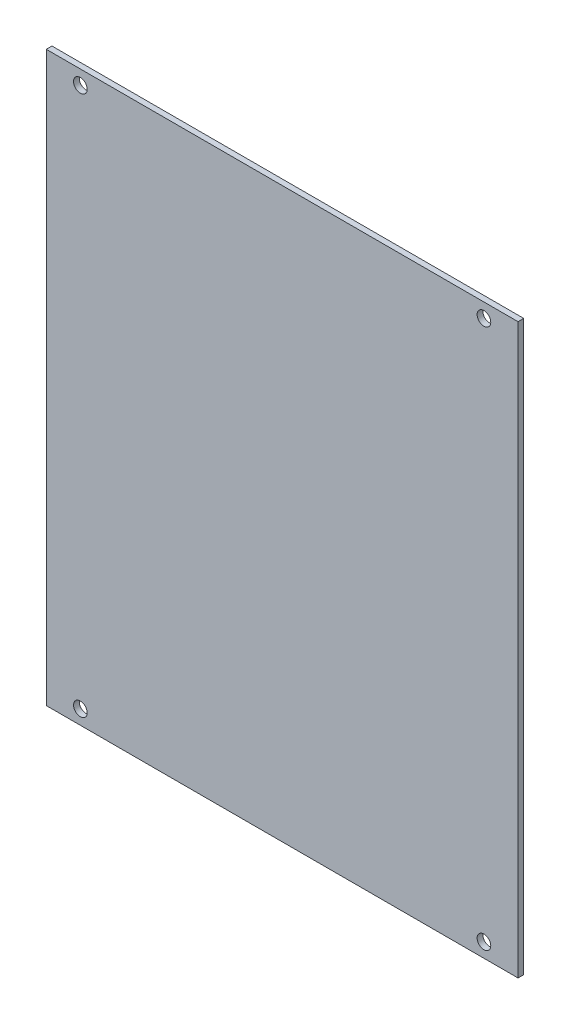
ISO-10303-21;
HEADER;
FILE_DESCRIPTION(('STEP AP214'),'2;1');
FILE_NAME('part.step','',(''),(''),'','','');
FILE_SCHEMA(('AUTOMOTIVE_DESIGN { 1 0 10303 214 1 1 1 1 }'));
ENDSEC;
DATA;
#1=APPLICATION_CONTEXT('core data for automotive mechanical design processes');
#2=APPLICATION_PROTOCOL_DEFINITION('international standard','automotive_design',2000,#1);
#3=PRODUCT_CONTEXT('',#1,'mechanical');
#4=PRODUCT('Part','Part','',(#3));
#5=PRODUCT_RELATED_PRODUCT_CATEGORY('part','',(#4));
#6=PRODUCT_DEFINITION_FORMATION('','',#4);
#7=PRODUCT_DEFINITION_CONTEXT('part definition',#1,'design');
#8=PRODUCT_DEFINITION('design','',#6,#7);
#9=PRODUCT_DEFINITION_SHAPE('','',#8);
#10=(LENGTH_UNIT() NAMED_UNIT(*) SI_UNIT(.MILLI.,.METRE.));
#11=(NAMED_UNIT(*) PLANE_ANGLE_UNIT() SI_UNIT($,.RADIAN.));
#12=(NAMED_UNIT(*) SI_UNIT($,.STERADIAN.) SOLID_ANGLE_UNIT());
#13=UNCERTAINTY_MEASURE_WITH_UNIT(LENGTH_MEASURE(1.E-05),#10,'distance_accuracy_value','');
#14=(GEOMETRIC_REPRESENTATION_CONTEXT(3) GLOBAL_UNCERTAINTY_ASSIGNED_CONTEXT((#13)) GLOBAL_UNIT_ASSIGNED_CONTEXT((#10,
#11,#12)) REPRESENTATION_CONTEXT('',''));
#15=CARTESIAN_POINT('',(0.,0.,0.));
#16=DIRECTION('',(0.,0.,1.));
#17=DIRECTION('',(1.,0.,0.));
#18=AXIS2_PLACEMENT_3D('',#15,#16,#17);
#19=CARTESIAN_POINT('',(41.5,-50.,0.5));
#20=DIRECTION('',(-1.,0.,0.));
#21=DIRECTION('',(0.,0.,1.));
#22=AXIS2_PLACEMENT_3D('',#19,#20,#21);
#23=PLANE('',#22);
#24=DIRECTION('',(0.,1.,0.));
#25=VECTOR('',#24,1.);
#26=CARTESIAN_POINT('',(41.5,-50.,-0.5));
#27=LINE('',#26,#25);
#28=CARTESIAN_POINT('',(41.5,-50.,-0.5));
#29=VERTEX_POINT('',#28);
#30=CARTESIAN_POINT('',(41.5,50.,-0.5));
#31=VERTEX_POINT('',#30);
#32=EDGE_CURVE('E97',#29,#31,#27,.T.);
#33=ORIENTED_EDGE('',*,*,#32,.T.);
#34=DIRECTION('',(0.,0.,-1.));
#35=VECTOR('',#34,1.);
#36=CARTESIAN_POINT('',(41.5,50.,0.5));
#37=LINE('',#36,#35);
#38=CARTESIAN_POINT('',(41.5,50.,0.5));
#39=VERTEX_POINT('',#38);
#40=EDGE_CURVE('E11',#39,#31,#37,.T.);
#41=ORIENTED_EDGE('',*,*,#40,.F.);
#42=DIRECTION('',(0.,1.,0.));
#43=VECTOR('',#42,1.);
#44=CARTESIAN_POINT('',(41.5,-50.,0.5));
#45=LINE('',#44,#43);
#46=CARTESIAN_POINT('',(41.5,-50.,0.5));
#47=VERTEX_POINT('',#46);
#48=EDGE_CURVE('E85',#47,#39,#45,.T.);
#49=ORIENTED_EDGE('',*,*,#48,.F.);
#50=DIRECTION('',(0.,0.,-1.));
#51=VECTOR('',#50,1.);
#52=CARTESIAN_POINT('',(41.5,-50.,0.5));
#53=LINE('',#52,#51);
#54=EDGE_CURVE('E93',#47,#29,#53,.T.);
#55=ORIENTED_EDGE('',*,*,#54,.T.);
#56=EDGE_LOOP('',(#33,#41,#49,#55));
#57=FACE_BOUND('',#56,.T.);
#58=ADVANCED_FACE('F34',(#57),#23,.F.);
#59=CARTESIAN_POINT('',(-41.5,50.,0.5));
#60=DIRECTION('',(0.,-1.,0.));
#61=DIRECTION('',(0.,0.,-1.));
#62=AXIS2_PLACEMENT_3D('',#59,#60,#61);
#63=PLANE('',#62);
#64=DIRECTION('',(-1.,0.,0.));
#65=VECTOR('',#64,1.);
#66=CARTESIAN_POINT('',(-41.5,50.,-0.5));
#67=LINE('',#66,#65);
#68=CARTESIAN_POINT('',(-41.5,50.,-0.5));
#69=VERTEX_POINT('',#68);
#70=EDGE_CURVE('E89',#31,#69,#67,.T.);
#71=ORIENTED_EDGE('',*,*,#70,.T.);
#72=DIRECTION('',(0.,0.,-1.));
#73=VECTOR('',#72,1.);
#74=CARTESIAN_POINT('',(-41.5,50.,0.5));
#75=LINE('',#74,#73);
#76=CARTESIAN_POINT('',(-41.5,50.,0.5));
#77=VERTEX_POINT('',#76);
#78=EDGE_CURVE('E42',#77,#69,#75,.T.);
#79=ORIENTED_EDGE('',*,*,#78,.F.);
#80=DIRECTION('',(-1.,0.,0.));
#81=VECTOR('',#80,1.);
#82=CARTESIAN_POINT('',(-41.5,50.,0.5));
#83=LINE('',#82,#81);
#84=EDGE_CURVE('E80',#39,#77,#83,.T.);
#85=ORIENTED_EDGE('',*,*,#84,.F.);
#86=ORIENTED_EDGE('',*,*,#40,.T.);
#87=EDGE_LOOP('',(#71,#79,#85,#86));
#88=FACE_BOUND('',#87,.T.);
#89=ADVANCED_FACE('F88',(#88),#63,.F.);
#90=CARTESIAN_POINT('',(-41.5,-50.,0.5));
#91=DIRECTION('',(1.,0.,0.));
#92=DIRECTION('',(0.,0.,-1.));
#93=AXIS2_PLACEMENT_3D('',#90,#91,#92);
#94=PLANE('',#93);
#95=DIRECTION('',(0.,-1.,0.));
#96=VECTOR('',#95,1.);
#97=CARTESIAN_POINT('',(-41.5,-50.,-0.5));
#98=LINE('',#97,#96);
#99=CARTESIAN_POINT('',(-41.5,-50.,-0.5));
#100=VERTEX_POINT('',#99);
#101=EDGE_CURVE('E67',#69,#100,#98,.T.);
#102=ORIENTED_EDGE('',*,*,#101,.T.);
#103=DIRECTION('',(0.,0.,-1.));
#104=VECTOR('',#103,1.);
#105=CARTESIAN_POINT('',(-41.5,-50.,0.5));
#106=LINE('',#105,#104);
#107=CARTESIAN_POINT('',(-41.5,-50.,0.5));
#108=VERTEX_POINT('',#107);
#109=EDGE_CURVE('E90',#108,#100,#106,.T.);
#110=ORIENTED_EDGE('',*,*,#109,.F.);
#111=DIRECTION('',(0.,-1.,0.));
#112=VECTOR('',#111,1.);
#113=CARTESIAN_POINT('',(-41.5,-50.,0.5));
#114=LINE('',#113,#112);
#115=EDGE_CURVE('E83',#77,#108,#114,.T.);
#116=ORIENTED_EDGE('',*,*,#115,.F.);
#117=ORIENTED_EDGE('',*,*,#78,.T.);
#118=EDGE_LOOP('',(#102,#110,#116,#117));
#119=FACE_BOUND('',#118,.T.);
#120=ADVANCED_FACE('F91',(#119),#94,.F.);
#121=CARTESIAN_POINT('',(-41.5,-50.,0.5));
#122=DIRECTION('',(0.,1.,0.));
#123=DIRECTION('',(0.,0.,1.));
#124=AXIS2_PLACEMENT_3D('',#121,#122,#123);
#125=PLANE('',#124);
#126=DIRECTION('',(1.,0.,0.));
#127=VECTOR('',#126,1.);
#128=CARTESIAN_POINT('',(-41.5,-50.,-0.5));
#129=LINE('',#128,#127);
#130=EDGE_CURVE('E73',#100,#29,#129,.T.);
#131=ORIENTED_EDGE('',*,*,#130,.T.);
#132=ORIENTED_EDGE('',*,*,#54,.F.);
#133=DIRECTION('',(1.,0.,0.));
#134=VECTOR('',#133,1.);
#135=CARTESIAN_POINT('',(-41.5,-50.,0.5));
#136=LINE('',#135,#134);
#137=EDGE_CURVE('E50',#108,#47,#136,.T.);
#138=ORIENTED_EDGE('',*,*,#137,.F.);
#139=ORIENTED_EDGE('',*,*,#109,.T.);
#140=EDGE_LOOP('',(#131,#132,#138,#139));
#141=FACE_BOUND('',#140,.T.);
#142=ADVANCED_FACE('F105',(#141),#125,.F.);
#143=CARTESIAN_POINT('',(0.,0.,0.5));
#144=DIRECTION('',(0.,0.,-1.));
#145=DIRECTION('',(-1.,0.,0.));
#146=AXIS2_PLACEMENT_3D('',#143,#144,#145);
#147=PLANE('',#146);
#148=CARTESIAN_POINT('',(-35.5,47.5,0.5));
#149=DIRECTION('',(0.,0.,1.));
#150=DIRECTION('',(1.,0.,0.));
#151=AXIS2_PLACEMENT_3D('',#148,#149,#150);
#152=CIRCLE('',#151,1.2);
#153=CARTESIAN_POINT('',(-34.3,47.5,0.5));
#154=VERTEX_POINT('',#153);
#155=EDGE_CURVE('E131',#154,#154,#152,.T.);
#156=ORIENTED_EDGE('',*,*,#155,.F.);
#157=EDGE_LOOP('',(#156));
#158=FACE_BOUND('',#157,.T.);
#159=CARTESIAN_POINT('',(35.5,47.4999999999999,0.5));
#160=DIRECTION('',(0.,0.,1.));
#161=DIRECTION('',(1.,0.,0.));
#162=AXIS2_PLACEMENT_3D('',#159,#160,#161);
#163=CIRCLE('',#162,1.2);
#164=CARTESIAN_POINT('',(36.7,47.4999999999999,0.5));
#165=VERTEX_POINT('',#164);
#166=EDGE_CURVE('E125',#165,#165,#163,.T.);
#167=ORIENTED_EDGE('',*,*,#166,.F.);
#168=EDGE_LOOP('',(#167));
#169=FACE_BOUND('',#168,.T.);
#170=CARTESIAN_POINT('',(-35.5,-47.5000000000001,0.5));
#171=DIRECTION('',(0.,0.,1.));
#172=DIRECTION('',(1.,0.,0.));
#173=AXIS2_PLACEMENT_3D('',#170,#171,#172);
#174=CIRCLE('',#173,1.2);
#175=CARTESIAN_POINT('',(-34.3,-47.5000000000001,0.5));
#176=VERTEX_POINT('',#175);
#177=EDGE_CURVE('E119',#176,#176,#174,.T.);
#178=ORIENTED_EDGE('',*,*,#177,.F.);
#179=EDGE_LOOP('',(#178));
#180=FACE_BOUND('',#179,.T.);
#181=CARTESIAN_POINT('',(35.5,-47.5,0.5));
#182=DIRECTION('',(0.,0.,1.));
#183=DIRECTION('',(1.,0.,0.));
#184=AXIS2_PLACEMENT_3D('',#181,#182,#183);
#185=CIRCLE('',#184,1.2);
#186=CARTESIAN_POINT('',(36.7,-47.5,0.5));
#187=VERTEX_POINT('',#186);
#188=EDGE_CURVE('E113',#187,#187,#185,.T.);
#189=ORIENTED_EDGE('',*,*,#188,.F.);
#190=EDGE_LOOP('',(#189));
#191=FACE_BOUND('',#190,.T.);
#192=ORIENTED_EDGE('',*,*,#48,.T.);
#193=ORIENTED_EDGE('',*,*,#84,.T.);
#194=ORIENTED_EDGE('',*,*,#115,.T.);
#195=ORIENTED_EDGE('',*,*,#137,.T.);
#196=EDGE_LOOP('',(#192,#193,#194,#195));
#197=FACE_BOUND('',#196,.T.);
#198=ADVANCED_FACE('F81',(#158,#169,#180,#191,#197),#147,.F.);
#199=CARTESIAN_POINT('',(0.,0.,-0.5));
#200=DIRECTION('',(0.,0.,-1.));
#201=DIRECTION('',(-1.,0.,0.));
#202=AXIS2_PLACEMENT_3D('',#199,#200,#201);
#203=PLANE('',#202);
#204=CARTESIAN_POINT('',(-35.5,47.5,-0.5));
#205=DIRECTION('',(0.,0.,1.));
#206=DIRECTION('',(1.,0.,0.));
#207=AXIS2_PLACEMENT_3D('',#204,#205,#206);
#208=CIRCLE('',#207,1.2);
#209=CARTESIAN_POINT('',(-34.3,47.5,-0.5));
#210=VERTEX_POINT('',#209);
#211=EDGE_CURVE('E128',#210,#210,#208,.T.);
#212=ORIENTED_EDGE('',*,*,#211,.T.);
#213=EDGE_LOOP('',(#212));
#214=FACE_BOUND('',#213,.T.);
#215=CARTESIAN_POINT('',(35.5,47.4999999999999,-0.5));
#216=DIRECTION('',(0.,0.,1.));
#217=DIRECTION('',(1.,0.,0.));
#218=AXIS2_PLACEMENT_3D('',#215,#216,#217);
#219=CIRCLE('',#218,1.2);
#220=CARTESIAN_POINT('',(36.7,47.4999999999999,-0.5));
#221=VERTEX_POINT('',#220);
#222=EDGE_CURVE('E122',#221,#221,#219,.T.);
#223=ORIENTED_EDGE('',*,*,#222,.T.);
#224=EDGE_LOOP('',(#223));
#225=FACE_BOUND('',#224,.T.);
#226=CARTESIAN_POINT('',(-35.5,-47.5000000000001,-0.5));
#227=DIRECTION('',(0.,0.,1.));
#228=DIRECTION('',(1.,0.,0.));
#229=AXIS2_PLACEMENT_3D('',#226,#227,#228);
#230=CIRCLE('',#229,1.2);
#231=CARTESIAN_POINT('',(-34.3,-47.5000000000001,-0.5));
#232=VERTEX_POINT('',#231);
#233=EDGE_CURVE('E116',#232,#232,#230,.T.);
#234=ORIENTED_EDGE('',*,*,#233,.T.);
#235=EDGE_LOOP('',(#234));
#236=FACE_BOUND('',#235,.T.);
#237=CARTESIAN_POINT('',(35.5,-47.5,-0.5));
#238=DIRECTION('',(0.,0.,1.));
#239=DIRECTION('',(1.,0.,0.));
#240=AXIS2_PLACEMENT_3D('',#237,#238,#239);
#241=CIRCLE('',#240,1.2);
#242=CARTESIAN_POINT('',(36.7,-47.5,-0.5));
#243=VERTEX_POINT('',#242);
#244=EDGE_CURVE('E100',#243,#243,#241,.T.);
#245=ORIENTED_EDGE('',*,*,#244,.T.);
#246=EDGE_LOOP('',(#245));
#247=FACE_BOUND('',#246,.T.);
#248=ORIENTED_EDGE('',*,*,#32,.F.);
#249=ORIENTED_EDGE('',*,*,#130,.F.);
#250=ORIENTED_EDGE('',*,*,#101,.F.);
#251=ORIENTED_EDGE('',*,*,#70,.F.);
#252=EDGE_LOOP('',(#248,#249,#250,#251));
#253=FACE_BOUND('',#252,.T.);
#254=ADVANCED_FACE('F108',(#214,#225,#236,#247,#253),#203,.T.);
#255=CARTESIAN_POINT('',(35.5,-47.5,0.5));
#256=DIRECTION('',(0.,0.,1.));
#257=DIRECTION('',(1.,0.,0.));
#258=AXIS2_PLACEMENT_3D('',#255,#256,#257);
#259=CYLINDRICAL_SURFACE('',#258,1.2);
#260=ORIENTED_EDGE('',*,*,#244,.F.);
#261=EDGE_LOOP('',(#260));
#262=FACE_BOUND('',#261,.T.);
#263=ORIENTED_EDGE('',*,*,#188,.T.);
#264=EDGE_LOOP('',(#263));
#265=FACE_BOUND('',#264,.T.);
#266=ADVANCED_FACE('F146',(#262,#265),#259,.F.);
#267=CARTESIAN_POINT('',(-35.5,-47.5000000000001,0.5));
#268=DIRECTION('',(0.,0.,1.));
#269=DIRECTION('',(1.,0.,0.));
#270=AXIS2_PLACEMENT_3D('',#267,#268,#269);
#271=CYLINDRICAL_SURFACE('',#270,1.2);
#272=ORIENTED_EDGE('',*,*,#233,.F.);
#273=EDGE_LOOP('',(#272));
#274=FACE_BOUND('',#273,.T.);
#275=ORIENTED_EDGE('',*,*,#177,.T.);
#276=EDGE_LOOP('',(#275));
#277=FACE_BOUND('',#276,.T.);
#278=ADVANCED_FACE('F148',(#274,#277),#271,.F.);
#279=CARTESIAN_POINT('',(35.5,47.4999999999999,0.5));
#280=DIRECTION('',(0.,0.,1.));
#281=DIRECTION('',(1.,0.,0.));
#282=AXIS2_PLACEMENT_3D('',#279,#280,#281);
#283=CYLINDRICAL_SURFACE('',#282,1.2);
#284=ORIENTED_EDGE('',*,*,#222,.F.);
#285=EDGE_LOOP('',(#284));
#286=FACE_BOUND('',#285,.T.);
#287=ORIENTED_EDGE('',*,*,#166,.T.);
#288=EDGE_LOOP('',(#287));
#289=FACE_BOUND('',#288,.T.);
#290=ADVANCED_FACE('F155',(#286,#289),#283,.F.);
#291=CARTESIAN_POINT('',(-35.5,47.5,0.5));
#292=DIRECTION('',(0.,0.,1.));
#293=DIRECTION('',(1.,0.,0.));
#294=AXIS2_PLACEMENT_3D('',#291,#292,#293);
#295=CYLINDRICAL_SURFACE('',#294,1.2);
#296=ORIENTED_EDGE('',*,*,#211,.F.);
#297=EDGE_LOOP('',(#296));
#298=FACE_BOUND('',#297,.T.);
#299=ORIENTED_EDGE('',*,*,#155,.T.);
#300=EDGE_LOOP('',(#299));
#301=FACE_BOUND('',#300,.T.);
#302=ADVANCED_FACE('F135',(#298,#301),#295,.F.);
#303=CLOSED_SHELL('',(#58,#89,#120,#142,#198,#254,#266,#278,#290,#302));
#304=MANIFOLD_SOLID_BREP('B2',#303);
#305=ADVANCED_BREP_SHAPE_REPRESENTATION('',(#18,#304),#14);
#306=SHAPE_DEFINITION_REPRESENTATION(#9,#305);
ENDSEC;
END-ISO-10303-21;
